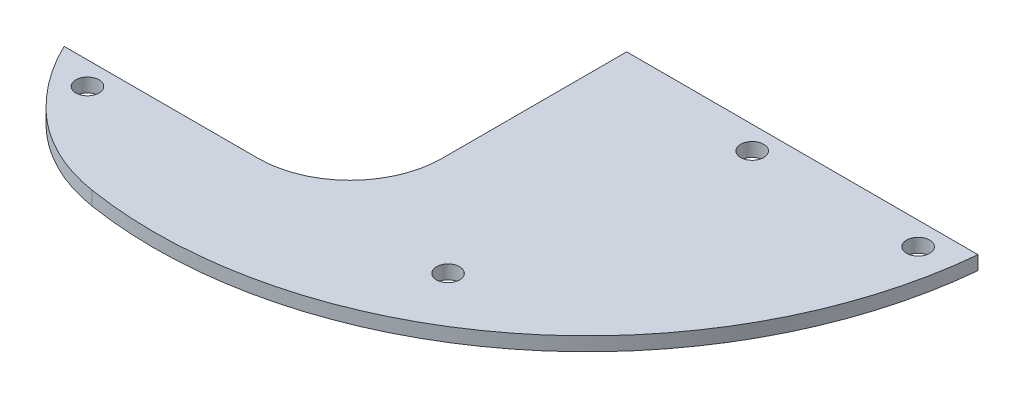
ISO-10303-21;
HEADER;
FILE_DESCRIPTION(('STEP AP214'),'2;1');
FILE_NAME('part.step','',(''),(''),'','','');
FILE_SCHEMA(('AUTOMOTIVE_DESIGN { 1 0 10303 214 1 1 1 1 }'));
ENDSEC;
DATA;
#1=APPLICATION_CONTEXT('core data for automotive mechanical design processes');
#2=APPLICATION_PROTOCOL_DEFINITION('international standard','automotive_design',2000,#1);
#3=PRODUCT_CONTEXT('',#1,'mechanical');
#4=PRODUCT('Part','Part','',(#3));
#5=PRODUCT_RELATED_PRODUCT_CATEGORY('part','',(#4));
#6=PRODUCT_DEFINITION_FORMATION('','',#4);
#7=PRODUCT_DEFINITION_CONTEXT('part definition',#1,'design');
#8=PRODUCT_DEFINITION('design','',#6,#7);
#9=PRODUCT_DEFINITION_SHAPE('','',#8);
#10=(LENGTH_UNIT() NAMED_UNIT(*) SI_UNIT(.MILLI.,.METRE.));
#11=(NAMED_UNIT(*) PLANE_ANGLE_UNIT() SI_UNIT($,.RADIAN.));
#12=(NAMED_UNIT(*) SI_UNIT($,.STERADIAN.) SOLID_ANGLE_UNIT());
#13=UNCERTAINTY_MEASURE_WITH_UNIT(LENGTH_MEASURE(1.E-05),#10,'distance_accuracy_value','');
#14=(GEOMETRIC_REPRESENTATION_CONTEXT(3) GLOBAL_UNCERTAINTY_ASSIGNED_CONTEXT((#13)) GLOBAL_UNIT_ASSIGNED_CONTEXT((#10,
#11,#12)) REPRESENTATION_CONTEXT('',''));
#15=CARTESIAN_POINT('',(0.,0.,0.));
#16=DIRECTION('',(0.,0.,1.));
#17=DIRECTION('',(1.,0.,0.));
#18=AXIS2_PLACEMENT_3D('',#15,#16,#17);
#19=CARTESIAN_POINT('',(-30.1341147076018,0.75,6.96162041960351));
#20=DIRECTION('',(0.,-1.,0.));
#21=DIRECTION('',(0.,0.,-1.));
#22=AXIS2_PLACEMENT_3D('',#19,#20,#21);
#23=CYLINDRICAL_SURFACE('',#22,18.4911885606472);
#24=CARTESIAN_POINT('',(-30.1341147076018,-0.75,6.96162041960351));
#25=DIRECTION('',(0.,1.,0.));
#26=DIRECTION('',(0.,0.,1.));
#27=AXIS2_PLACEMENT_3D('',#24,#25,#26);
#28=CIRCLE('',#27,18.4911885606472);
#29=CARTESIAN_POINT('',(-33.0166784325,-0.75,25.2267478694));
#30=VERTEX_POINT('',#29);
#31=CARTESIAN_POINT('',(-43.0166784325,-0.75,20.2267478694));
#32=VERTEX_POINT('',#31);
#33=EDGE_CURVE('E121',#30,#32,#28,.F.);
#34=ORIENTED_EDGE('',*,*,#33,.F.);
#35=DIRECTION('',(0.,-1.,0.));
#36=VECTOR('',#35,1.);
#37=CARTESIAN_POINT('',(-33.0166784325,0.75,25.2267478694));
#38=LINE('',#37,#36);
#39=CARTESIAN_POINT('',(-33.0166784325,0.75,25.2267478694));
#40=VERTEX_POINT('',#39);
#41=EDGE_CURVE('E11',#40,#30,#38,.T.);
#42=ORIENTED_EDGE('',*,*,#41,.F.);
#43=CARTESIAN_POINT('',(-30.1341147076018,0.75,6.96162041960351));
#44=DIRECTION('',(0.,1.,0.));
#45=DIRECTION('',(0.,0.,1.));
#46=AXIS2_PLACEMENT_3D('',#43,#44,#45);
#47=CIRCLE('',#46,18.4911885606472);
#48=CARTESIAN_POINT('',(-43.0166784325,0.75,20.2267478694));
#49=VERTEX_POINT('',#48);
#50=EDGE_CURVE('E52',#40,#49,#47,.F.);
#51=ORIENTED_EDGE('',*,*,#50,.T.);
#52=DIRECTION('',(0.,-1.,0.));
#53=VECTOR('',#52,1.);
#54=CARTESIAN_POINT('',(-43.0166784325,0.75,20.2267478694));
#55=LINE('',#54,#53);
#56=EDGE_CURVE('E80',#49,#32,#55,.T.);
#57=ORIENTED_EDGE('',*,*,#56,.T.);
#58=EDGE_LOOP('',(#34,#42,#51,#57));
#59=FACE_BOUND('',#58,.T.);
#60=ADVANCED_FACE('F34',(#59),#23,.T.);
#61=CARTESIAN_POINT('',(-25.6899187368823,0.75,-21.1986610395442));
#62=DIRECTION('',(0.,-1.,0.));
#63=DIRECTION('',(0.,0.,-1.));
#64=AXIS2_PLACEMENT_3D('',#61,#62,#63);
#65=CYLINDRICAL_SURFACE('',#64,47.);
#66=CARTESIAN_POINT('',(-25.6899187368823,-0.75,-21.1986610395442));
#67=DIRECTION('',(0.,1.,0.));
#68=DIRECTION('',(0.,0.,1.));
#69=AXIS2_PLACEMENT_3D('',#66,#67,#68);
#70=CIRCLE('',#69,47.);
#71=CARTESIAN_POINT('',(21.1012744087155,-0.75,-16.7732521306));
#72=VERTEX_POINT('',#71);
#73=EDGE_CURVE('E123',#30,#72,#70,.T.);
#74=ORIENTED_EDGE('',*,*,#73,.T.);
#75=DIRECTION('',(0.,-1.,0.));
#76=VECTOR('',#75,1.);
#77=CARTESIAN_POINT('',(21.1012744087155,0.75,-16.7732521306));
#78=LINE('',#77,#76);
#79=CARTESIAN_POINT('',(21.1012744087155,0.75,-16.7732521306));
#80=VERTEX_POINT('',#79);
#81=EDGE_CURVE('E43',#80,#72,#78,.T.);
#82=ORIENTED_EDGE('',*,*,#81,.F.);
#83=CARTESIAN_POINT('',(-25.6899187368823,0.75,-21.1986610395442));
#84=DIRECTION('',(0.,1.,0.));
#85=DIRECTION('',(0.,0.,1.));
#86=AXIS2_PLACEMENT_3D('',#83,#84,#85);
#87=CIRCLE('',#86,47.);
#88=EDGE_CURVE('E162',#40,#80,#87,.T.);
#89=ORIENTED_EDGE('',*,*,#88,.F.);
#90=ORIENTED_EDGE('',*,*,#41,.T.);
#91=EDGE_LOOP('',(#74,#82,#89,#90));
#92=FACE_BOUND('',#91,.T.);
#93=ADVANCED_FACE('F165',(#92),#65,.T.);
#94=CARTESIAN_POINT('',(0.,0.75,-16.7732521306));
#95=DIRECTION('',(0.,0.,1.));
#96=DIRECTION('',(1.,0.,0.));
#97=AXIS2_PLACEMENT_3D('',#94,#95,#96);
#98=PLANE('',#97);
#99=DIRECTION('',(-1.,0.,0.));
#100=VECTOR('',#99,1.);
#101=CARTESIAN_POINT('',(0.,-0.75,-16.7732521306));
#102=LINE('',#101,#100);
#103=CARTESIAN_POINT('',(-17.0166784325,-0.75,-16.7732521306));
#104=VERTEX_POINT('',#103);
#105=EDGE_CURVE('E126',#72,#104,#102,.T.);
#106=ORIENTED_EDGE('',*,*,#105,.T.);
#107=DIRECTION('',(0.,-1.,0.));
#108=VECTOR('',#107,1.);
#109=CARTESIAN_POINT('',(-17.0166784325,0.75,-16.7732521306));
#110=LINE('',#109,#108);
#111=CARTESIAN_POINT('',(-17.0166784325,0.75,-16.7732521306));
#112=VERTEX_POINT('',#111);
#113=EDGE_CURVE('E111',#112,#104,#110,.T.);
#114=ORIENTED_EDGE('',*,*,#113,.F.);
#115=DIRECTION('',(-1.,0.,0.));
#116=VECTOR('',#115,1.);
#117=CARTESIAN_POINT('',(0.,0.75,-16.7732521306));
#118=LINE('',#117,#116);
#119=EDGE_CURVE('E102',#80,#112,#118,.T.);
#120=ORIENTED_EDGE('',*,*,#119,.F.);
#121=ORIENTED_EDGE('',*,*,#81,.T.);
#122=EDGE_LOOP('',(#106,#114,#120,#121));
#123=FACE_BOUND('',#122,.T.);
#124=ADVANCED_FACE('F169',(#123),#98,.F.);
#125=CARTESIAN_POINT('',(-17.0166784325,0.75,0.));
#126=DIRECTION('',(1.,0.,0.));
#127=DIRECTION('',(0.,0.,-1.));
#128=AXIS2_PLACEMENT_3D('',#125,#126,#127);
#129=PLANE('',#128);
#130=DIRECTION('',(0.,0.,1.));
#131=VECTOR('',#130,1.);
#132=CARTESIAN_POINT('',(-17.0166784325,-0.75,0.));
#133=LINE('',#132,#131);
#134=CARTESIAN_POINT('',(-17.0166784325,-0.75,3.2267478694));
#135=VERTEX_POINT('',#134);
#136=EDGE_CURVE('E110',#104,#135,#133,.T.);
#137=ORIENTED_EDGE('',*,*,#136,.T.);
#138=DIRECTION('',(0.,-1.,0.));
#139=VECTOR('',#138,1.);
#140=CARTESIAN_POINT('',(-17.0166784325,0.75,3.2267478694));
#141=LINE('',#140,#139);
#142=CARTESIAN_POINT('',(-17.0166784325,0.75,3.2267478694));
#143=VERTEX_POINT('',#142);
#144=EDGE_CURVE('E107',#143,#135,#141,.T.);
#145=ORIENTED_EDGE('',*,*,#144,.F.);
#146=DIRECTION('',(0.,0.,1.));
#147=VECTOR('',#146,1.);
#148=CARTESIAN_POINT('',(-17.0166784325,0.75,0.));
#149=LINE('',#148,#147);
#150=EDGE_CURVE('E95',#112,#143,#149,.T.);
#151=ORIENTED_EDGE('',*,*,#150,.F.);
#152=ORIENTED_EDGE('',*,*,#113,.T.);
#153=EDGE_LOOP('',(#137,#145,#151,#152));
#154=FACE_BOUND('',#153,.T.);
#155=ADVANCED_FACE('F108',(#154),#129,.F.);
#156=CARTESIAN_POINT('',(-27.0166784325,0.75,3.2267478694));
#157=DIRECTION('',(0.,-1.,0.));
#158=DIRECTION('',(0.,0.,-1.));
#159=AXIS2_PLACEMENT_3D('',#156,#157,#158);
#160=CYLINDRICAL_SURFACE('',#159,10.);
#161=CARTESIAN_POINT('',(-27.0166784325,-0.75,3.2267478694));
#162=DIRECTION('',(0.,1.,0.));
#163=DIRECTION('',(0.,0.,1.));
#164=AXIS2_PLACEMENT_3D('',#161,#162,#163);
#165=CIRCLE('',#164,10.);
#166=CARTESIAN_POINT('',(-27.0166784325,-0.75,13.2267478694));
#167=VERTEX_POINT('',#166);
#168=EDGE_CURVE('E76',#135,#167,#165,.F.);
#169=ORIENTED_EDGE('',*,*,#168,.T.);
#170=DIRECTION('',(0.,-1.,0.));
#171=VECTOR('',#170,1.);
#172=CARTESIAN_POINT('',(-27.0166784325,0.75,13.2267478694));
#173=LINE('',#172,#171);
#174=CARTESIAN_POINT('',(-27.0166784325,0.75,13.2267478694));
#175=VERTEX_POINT('',#174);
#176=EDGE_CURVE('E112',#175,#167,#173,.T.);
#177=ORIENTED_EDGE('',*,*,#176,.F.);
#178=CARTESIAN_POINT('',(-27.0166784325,0.75,3.2267478694));
#179=DIRECTION('',(0.,1.,0.));
#180=DIRECTION('',(0.,0.,1.));
#181=AXIS2_PLACEMENT_3D('',#178,#179,#180);
#182=CIRCLE('',#181,10.);
#183=EDGE_CURVE('E100',#143,#175,#182,.F.);
#184=ORIENTED_EDGE('',*,*,#183,.F.);
#185=ORIENTED_EDGE('',*,*,#144,.T.);
#186=EDGE_LOOP('',(#169,#177,#184,#185));
#187=FACE_BOUND('',#186,.T.);
#188=ADVANCED_FACE('F114',(#187),#160,.F.);
#189=CARTESIAN_POINT('',(0.,0.75,13.2267478694));
#190=DIRECTION('',(0.,0.,1.));
#191=DIRECTION('',(1.,0.,0.));
#192=AXIS2_PLACEMENT_3D('',#189,#190,#191);
#193=PLANE('',#192);
#194=DIRECTION('',(-1.,0.,0.));
#195=VECTOR('',#194,1.);
#196=CARTESIAN_POINT('',(0.,-0.75,13.2267478694));
#197=LINE('',#196,#195);
#198=CARTESIAN_POINT('',(-48.0551271056036,-0.750000000000001,13.2267478694));
#199=VERTEX_POINT('',#198);
#200=EDGE_CURVE('E130',#167,#199,#197,.T.);
#201=ORIENTED_EDGE('',*,*,#200,.T.);
#202=DIRECTION('',(0.,1.,0.));
#203=VECTOR('',#202,1.);
#204=CARTESIAN_POINT('',(-48.0551271056036,-9.37472985266783,13.2267478694));
#205=LINE('',#204,#203);
#206=CARTESIAN_POINT('',(-48.0551271056036,0.75,13.2267478694));
#207=VERTEX_POINT('',#206);
#208=EDGE_CURVE('E153',#199,#207,#205,.T.);
#209=ORIENTED_EDGE('',*,*,#208,.T.);
#210=DIRECTION('',(-1.,0.,0.));
#211=VECTOR('',#210,1.);
#212=CARTESIAN_POINT('',(0.,0.75,13.2267478694));
#213=LINE('',#212,#211);
#214=EDGE_CURVE('E116',#175,#207,#213,.T.);
#215=ORIENTED_EDGE('',*,*,#214,.F.);
#216=ORIENTED_EDGE('',*,*,#176,.T.);
#217=EDGE_LOOP('',(#201,#209,#215,#216));
#218=FACE_BOUND('',#217,.T.);
#219=ADVANCED_FACE('F177',(#218),#193,.F.);
#220=CARTESIAN_POINT('',(0.,0.75,0.));
#221=DIRECTION('',(0.,1.,0.));
#222=DIRECTION('',(0.,0.,1.));
#223=AXIS2_PLACEMENT_3D('',#220,#221,#222);
#224=PLANE('',#223);
#225=CARTESIAN_POINT('',(-43.0166784325,0.75,15.7267478694));
#226=DIRECTION('',(0.,1.,0.));
#227=DIRECTION('',(0.,0.,1.));
#228=AXIS2_PLACEMENT_3D('',#225,#226,#227);
#229=CIRCLE('',#228,1.25000000000001);
#230=CARTESIAN_POINT('',(-43.0166784325,0.75,16.9767478694));
#231=VERTEX_POINT('',#230);
#232=EDGE_CURVE('E142',#231,#231,#229,.T.);
#233=ORIENTED_EDGE('',*,*,#232,.F.);
#234=EDGE_LOOP('',(#233));
#235=FACE_BOUND('',#234,.T.);
#236=CARTESIAN_POINT('',(-0.898725591284504,0.75,-14.2732521306));
#237=DIRECTION('',(0.,1.,0.));
#238=DIRECTION('',(0.,0.,1.));
#239=AXIS2_PLACEMENT_3D('',#236,#237,#238);
#240=CIRCLE('',#239,1.25);
#241=CARTESIAN_POINT('',(-0.898725591284504,0.75,-13.0232521306));
#242=VERTEX_POINT('',#241);
#243=EDGE_CURVE('E218',#242,#242,#240,.T.);
#244=ORIENTED_EDGE('',*,*,#243,.F.);
#245=EDGE_LOOP('',(#244));
#246=FACE_BOUND('',#245,.T.);
#247=CARTESIAN_POINT('',(-5.8987255912845,0.75,13.7267478694));
#248=DIRECTION('',(0.,1.,0.));
#249=DIRECTION('',(0.,0.,1.));
#250=AXIS2_PLACEMENT_3D('',#247,#248,#249);
#251=CIRCLE('',#250,1.25);
#252=CARTESIAN_POINT('',(-5.8987255912845,0.75,14.9767478694));
#253=VERTEX_POINT('',#252);
#254=EDGE_CURVE('E222',#253,#253,#251,.T.);
#255=ORIENTED_EDGE('',*,*,#254,.F.);
#256=EDGE_LOOP('',(#255));
#257=FACE_BOUND('',#256,.T.);
#258=CARTESIAN_POINT('',(17.1012744087155,0.75,-14.2732521306));
#259=DIRECTION('',(0.,1.,0.));
#260=DIRECTION('',(0.,0.,1.));
#261=AXIS2_PLACEMENT_3D('',#258,#259,#260);
#262=CIRCLE('',#261,1.25);
#263=CARTESIAN_POINT('',(17.1012744087155,0.75,-13.0232521306));
#264=VERTEX_POINT('',#263);
#265=EDGE_CURVE('E225',#264,#264,#262,.T.);
#266=ORIENTED_EDGE('',*,*,#265,.F.);
#267=EDGE_LOOP('',(#266));
#268=FACE_BOUND('',#267,.T.);
#269=ORIENTED_EDGE('',*,*,#50,.F.);
#270=ORIENTED_EDGE('',*,*,#88,.T.);
#271=ORIENTED_EDGE('',*,*,#119,.T.);
#272=ORIENTED_EDGE('',*,*,#150,.T.);
#273=ORIENTED_EDGE('',*,*,#183,.T.);
#274=ORIENTED_EDGE('',*,*,#214,.T.);
#275=CARTESIAN_POINT('',(-25.8725124877887,0.75,2.57346463063587));
#276=DIRECTION('',(0.,1.,0.));
#277=DIRECTION('',(0.,0.,1.));
#278=AXIS2_PLACEMENT_3D('',#275,#276,#277);
#279=CIRCLE('',#278,24.6081457051894);
#280=EDGE_CURVE('E149',#207,#49,#279,.T.);
#281=ORIENTED_EDGE('',*,*,#280,.T.);
#282=EDGE_LOOP('',(#269,#270,#271,#272,#273,#274,#281));
#283=FACE_BOUND('',#282,.T.);
#284=ADVANCED_FACE('F97',(#235,#246,#257,#268,#283),#224,.T.);
#285=CARTESIAN_POINT('',(0.,-0.75,0.));
#286=DIRECTION('',(0.,1.,0.));
#287=DIRECTION('',(0.,0.,1.));
#288=AXIS2_PLACEMENT_3D('',#285,#286,#287);
#289=PLANE('',#288);
#290=CARTESIAN_POINT('',(-43.0166784325,-0.750000000000001,15.7267478694));
#291=DIRECTION('',(0.,1.,0.));
#292=DIRECTION('',(0.,0.,1.));
#293=AXIS2_PLACEMENT_3D('',#290,#291,#292);
#294=CIRCLE('',#293,1.25000000000001);
#295=CARTESIAN_POINT('',(-43.0166784325,-0.750000000000001,16.9767478694));
#296=VERTEX_POINT('',#295);
#297=EDGE_CURVE('E37',#296,#296,#294,.T.);
#298=ORIENTED_EDGE('',*,*,#297,.T.);
#299=EDGE_LOOP('',(#298));
#300=FACE_BOUND('',#299,.T.);
#301=CARTESIAN_POINT('',(-0.898725591284504,-0.750000000000001,-14.2732521306));
#302=DIRECTION('',(0.,1.,0.));
#303=DIRECTION('',(0.,0.,1.));
#304=AXIS2_PLACEMENT_3D('',#301,#302,#303);
#305=CIRCLE('',#304,1.25);
#306=CARTESIAN_POINT('',(-0.898725591284504,-0.750000000000001,-13.0232521306));
#307=VERTEX_POINT('',#306);
#308=EDGE_CURVE('E144',#307,#307,#305,.T.);
#309=ORIENTED_EDGE('',*,*,#308,.T.);
#310=EDGE_LOOP('',(#309));
#311=FACE_BOUND('',#310,.T.);
#312=CARTESIAN_POINT('',(-5.8987255912845,-0.750000000000001,13.7267478694));
#313=DIRECTION('',(0.,1.,0.));
#314=DIRECTION('',(0.,0.,1.));
#315=AXIS2_PLACEMENT_3D('',#312,#313,#314);
#316=CIRCLE('',#315,1.25);
#317=CARTESIAN_POINT('',(-5.8987255912845,-0.750000000000001,14.9767478694));
#318=VERTEX_POINT('',#317);
#319=EDGE_CURVE('E141',#318,#318,#316,.T.);
#320=ORIENTED_EDGE('',*,*,#319,.T.);
#321=EDGE_LOOP('',(#320));
#322=FACE_BOUND('',#321,.T.);
#323=CARTESIAN_POINT('',(17.1012744087155,-0.750000000000001,-14.2732521306));
#324=DIRECTION('',(0.,1.,0.));
#325=DIRECTION('',(0.,0.,1.));
#326=AXIS2_PLACEMENT_3D('',#323,#324,#325);
#327=CIRCLE('',#326,1.25);
#328=CARTESIAN_POINT('',(17.1012744087155,-0.750000000000001,-13.0232521306));
#329=VERTEX_POINT('',#328);
#330=EDGE_CURVE('E138',#329,#329,#327,.T.);
#331=ORIENTED_EDGE('',*,*,#330,.T.);
#332=EDGE_LOOP('',(#331));
#333=FACE_BOUND('',#332,.T.);
#334=ORIENTED_EDGE('',*,*,#33,.T.);
#335=CARTESIAN_POINT('',(-25.8725124877887,-0.750000000000001,2.57346463063587));
#336=DIRECTION('',(0.,1.,0.));
#337=DIRECTION('',(0.,0.,1.));
#338=AXIS2_PLACEMENT_3D('',#335,#336,#337);
#339=CIRCLE('',#338,24.6081457051894);
#340=EDGE_CURVE('E124',#32,#199,#339,.F.);
#341=ORIENTED_EDGE('',*,*,#340,.T.);
#342=ORIENTED_EDGE('',*,*,#200,.F.);
#343=ORIENTED_EDGE('',*,*,#168,.F.);
#344=ORIENTED_EDGE('',*,*,#136,.F.);
#345=ORIENTED_EDGE('',*,*,#105,.F.);
#346=ORIENTED_EDGE('',*,*,#73,.F.);
#347=EDGE_LOOP('',(#334,#341,#342,#343,#344,#345,#346));
#348=FACE_BOUND('',#347,.T.);
#349=ADVANCED_FACE('F171',(#300,#311,#322,#333,#348),#289,.F.);
#350=CARTESIAN_POINT('',(-25.8725124877887,-9.37472985266783,2.57346463063587));
#351=DIRECTION('',(0.,1.,0.));
#352=DIRECTION('',(0.,0.,1.));
#353=AXIS2_PLACEMENT_3D('',#350,#351,#352);
#354=CYLINDRICAL_SURFACE('',#353,24.6081457051894);
#355=ORIENTED_EDGE('',*,*,#340,.F.);
#356=ORIENTED_EDGE('',*,*,#56,.F.);
#357=ORIENTED_EDGE('',*,*,#280,.F.);
#358=ORIENTED_EDGE('',*,*,#208,.F.);
#359=EDGE_LOOP('',(#355,#356,#357,#358));
#360=FACE_BOUND('',#359,.T.);
#361=ADVANCED_FACE('F180',(#360),#354,.T.);
#362=CARTESIAN_POINT('',(17.1012744087155,-9.25,-14.2732521306));
#363=DIRECTION('',(0.,1.,0.));
#364=DIRECTION('',(0.,0.,1.));
#365=AXIS2_PLACEMENT_3D('',#362,#363,#364);
#366=CYLINDRICAL_SURFACE('',#365,1.25);
#367=ORIENTED_EDGE('',*,*,#265,.T.);
#368=EDGE_LOOP('',(#367));
#369=FACE_BOUND('',#368,.T.);
#370=ORIENTED_EDGE('',*,*,#330,.F.);
#371=EDGE_LOOP('',(#370));
#372=FACE_BOUND('',#371,.T.);
#373=ADVANCED_FACE('F182',(#369,#372),#366,.F.);
#374=CARTESIAN_POINT('',(-5.8987255912845,-9.25,13.7267478694));
#375=DIRECTION('',(0.,1.,0.));
#376=DIRECTION('',(0.,0.,1.));
#377=AXIS2_PLACEMENT_3D('',#374,#375,#376);
#378=CYLINDRICAL_SURFACE('',#377,1.25);
#379=ORIENTED_EDGE('',*,*,#254,.T.);
#380=EDGE_LOOP('',(#379));
#381=FACE_BOUND('',#380,.T.);
#382=ORIENTED_EDGE('',*,*,#319,.F.);
#383=EDGE_LOOP('',(#382));
#384=FACE_BOUND('',#383,.T.);
#385=ADVANCED_FACE('F188',(#381,#384),#378,.F.);
#386=CARTESIAN_POINT('',(-0.898725591284504,-9.25,-14.2732521306));
#387=DIRECTION('',(0.,1.,0.));
#388=DIRECTION('',(0.,0.,1.));
#389=AXIS2_PLACEMENT_3D('',#386,#387,#388);
#390=CYLINDRICAL_SURFACE('',#389,1.25);
#391=ORIENTED_EDGE('',*,*,#243,.T.);
#392=EDGE_LOOP('',(#391));
#393=FACE_BOUND('',#392,.T.);
#394=ORIENTED_EDGE('',*,*,#308,.F.);
#395=EDGE_LOOP('',(#394));
#396=FACE_BOUND('',#395,.T.);
#397=ADVANCED_FACE('F230',(#393,#396),#390,.F.);
#398=CARTESIAN_POINT('',(-43.0166784325,-9.25,15.7267478694));
#399=DIRECTION('',(0.,1.,0.));
#400=DIRECTION('',(0.,0.,1.));
#401=AXIS2_PLACEMENT_3D('',#398,#399,#400);
#402=CYLINDRICAL_SURFACE('',#401,1.25000000000001);
#403=ORIENTED_EDGE('',*,*,#232,.T.);
#404=EDGE_LOOP('',(#403));
#405=FACE_BOUND('',#404,.T.);
#406=ORIENTED_EDGE('',*,*,#297,.F.);
#407=EDGE_LOOP('',(#406));
#408=FACE_BOUND('',#407,.T.);
#409=ADVANCED_FACE('F233',(#405,#408),#402,.F.);
#410=CLOSED_SHELL('',(#60,#93,#124,#155,#188,#219,#284,#349,#361,#373,#385,#397,#409));
#411=MANIFOLD_SOLID_BREP('B2',#410);
#412=ADVANCED_BREP_SHAPE_REPRESENTATION('',(#18,#411),#14);
#413=SHAPE_DEFINITION_REPRESENTATION(#9,#412);
ENDSEC;
END-ISO-10303-21;
